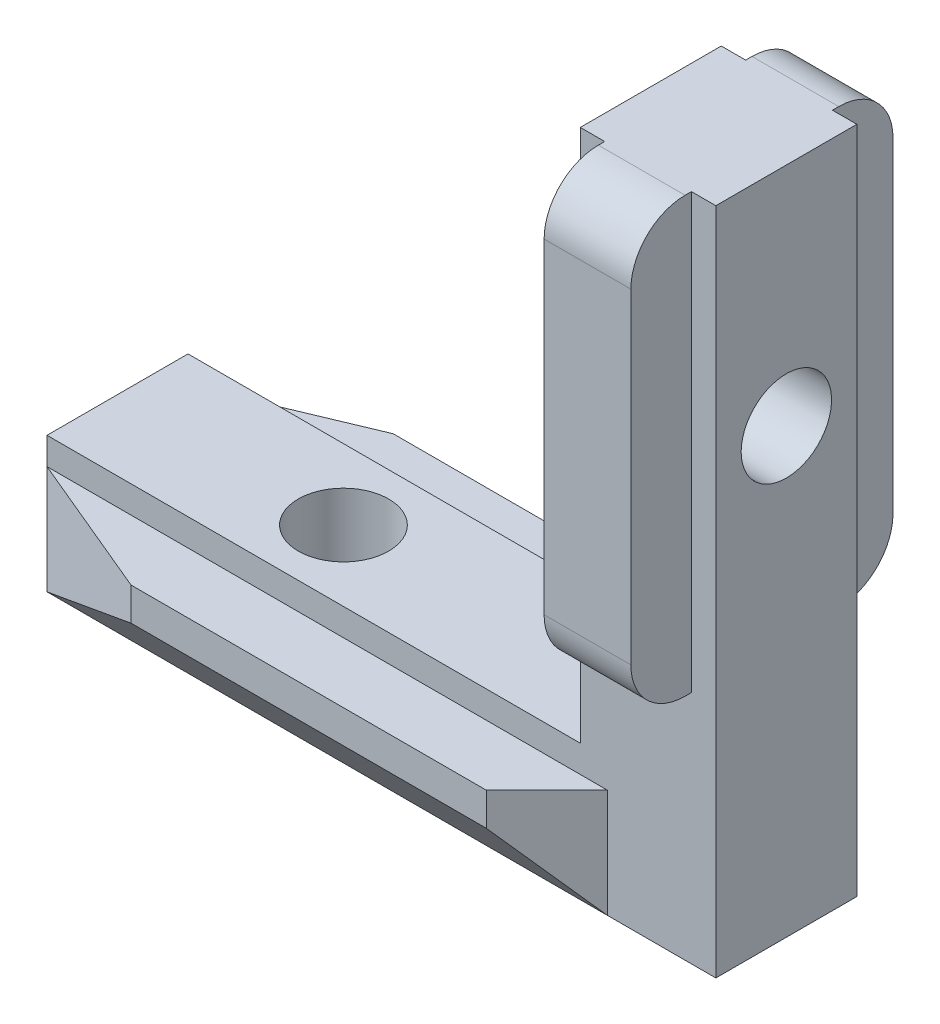
ISO-10303-21;
HEADER;
FILE_DESCRIPTION(('STEP AP214'),'2;1');
FILE_NAME('part.step','',(''),(''),'','','');
FILE_SCHEMA(('AUTOMOTIVE_DESIGN { 1 0 10303 214 1 1 1 1 }'));
ENDSEC;
DATA;
#1=APPLICATION_CONTEXT('core data for automotive mechanical design processes');
#2=APPLICATION_PROTOCOL_DEFINITION('international standard','automotive_design',2000,#1);
#3=PRODUCT_CONTEXT('',#1,'mechanical');
#4=PRODUCT('Part','Part','',(#3));
#5=PRODUCT_RELATED_PRODUCT_CATEGORY('part','',(#4));
#6=PRODUCT_DEFINITION_FORMATION('','',#4);
#7=PRODUCT_DEFINITION_CONTEXT('part definition',#1,'design');
#8=PRODUCT_DEFINITION('design','',#6,#7);
#9=PRODUCT_DEFINITION_SHAPE('','',#8);
#10=(LENGTH_UNIT() NAMED_UNIT(*) SI_UNIT(.MILLI.,.METRE.));
#11=(NAMED_UNIT(*) PLANE_ANGLE_UNIT() SI_UNIT($,.RADIAN.));
#12=(NAMED_UNIT(*) SI_UNIT($,.STERADIAN.) SOLID_ANGLE_UNIT());
#13=UNCERTAINTY_MEASURE_WITH_UNIT(LENGTH_MEASURE(1.E-05),#10,'distance_accuracy_value','');
#14=(GEOMETRIC_REPRESENTATION_CONTEXT(3) GLOBAL_UNCERTAINTY_ASSIGNED_CONTEXT((#13)) GLOBAL_UNIT_ASSIGNED_CONTEXT((#10,
#11,#12)) REPRESENTATION_CONTEXT('',''));
#15=CARTESIAN_POINT('',(0.,0.,0.));
#16=DIRECTION('',(0.,0.,1.));
#17=DIRECTION('',(1.,0.,0.));
#18=AXIS2_PLACEMENT_3D('',#15,#16,#17);
#19=CARTESIAN_POINT('',(0.,0.,-3.9));
#20=DIRECTION('',(0.,0.,1.));
#21=DIRECTION('',(1.,0.,0.));
#22=AXIS2_PLACEMENT_3D('',#19,#20,#21);
#23=PLANE('',#22);
#24=DIRECTION('',(0.,1.,0.));
#25=VECTOR('',#24,1.);
#26=CARTESIAN_POINT('',(-6.15,37.,-3.9));
#27=LINE('',#26,#25);
#28=CARTESIAN_POINT('',(-6.15,13.,-3.9));
#29=VERTEX_POINT('',#28);
#30=CARTESIAN_POINT('',(-6.15,37.,-3.9));
#31=VERTEX_POINT('',#30);
#32=EDGE_CURVE('E235',#29,#31,#27,.T.);
#33=ORIENTED_EDGE('',*,*,#32,.F.);
#34=DIRECTION('',(1.,0.,0.));
#35=VECTOR('',#34,1.);
#36=CARTESIAN_POINT('',(-6.15,13.,-3.9));
#37=LINE('',#36,#35);
#38=CARTESIAN_POINT('',(-1.35,13.,-3.9));
#39=VERTEX_POINT('',#38);
#40=EDGE_CURVE('E248',#29,#39,#37,.T.);
#41=ORIENTED_EDGE('',*,*,#40,.T.);
#42=DIRECTION('',(0.,1.,0.));
#43=VECTOR('',#42,1.);
#44=CARTESIAN_POINT('',(-1.35,37.,-3.9));
#45=LINE('',#44,#43);
#46=CARTESIAN_POINT('',(-1.35,37.,-3.9));
#47=VERTEX_POINT('',#46);
#48=EDGE_CURVE('E228',#39,#47,#45,.T.);
#49=ORIENTED_EDGE('',*,*,#48,.T.);
#50=DIRECTION('',(-1.,0.,0.));
#51=VECTOR('',#50,1.);
#52=CARTESIAN_POINT('',(-7.5,37.,-3.9));
#53=LINE('',#52,#51);
#54=CARTESIAN_POINT('',(0.,37.,-3.9));
#55=VERTEX_POINT('',#54);
#56=EDGE_CURVE('E422',#55,#47,#53,.T.);
#57=ORIENTED_EDGE('',*,*,#56,.F.);
#58=DIRECTION('',(0.,1.,0.));
#59=VECTOR('',#58,1.);
#60=CARTESIAN_POINT('',(0.,0.,-3.9));
#61=LINE('',#60,#59);
#62=CARTESIAN_POINT('',(0.,0.,-3.9));
#63=VERTEX_POINT('',#62);
#64=EDGE_CURVE('E414',#63,#55,#61,.T.);
#65=ORIENTED_EDGE('',*,*,#64,.F.);
#66=DIRECTION('',(1.,0.,0.));
#67=VECTOR('',#66,1.);
#68=CARTESIAN_POINT('',(-37.,0.,-3.9));
#69=LINE('',#68,#67);
#70=CARTESIAN_POINT('',(-6.0000000000001,0.,-3.9));
#71=VERTEX_POINT('',#70);
#72=EDGE_CURVE('E410',#71,#63,#69,.T.);
#73=ORIENTED_EDGE('',*,*,#72,.F.);
#74=DIRECTION('',(0.,1.,0.));
#75=VECTOR('',#74,1.);
#76=CARTESIAN_POINT('',(-6.0000000000001,0.,-3.9));
#77=LINE('',#76,#75);
#78=CARTESIAN_POINT('',(-6.0000000000001,6.,-3.9));
#79=VERTEX_POINT('',#78);
#80=EDGE_CURVE('E11',#71,#79,#77,.T.);
#81=ORIENTED_EDGE('',*,*,#80,.T.);
#82=DIRECTION('',(-1.,0.,0.));
#83=VECTOR('',#82,1.);
#84=CARTESIAN_POINT('',(-1.35,6.,-3.9));
#85=LINE('',#84,#83);
#86=CARTESIAN_POINT('',(-37.,6.,-3.9));
#87=VERTEX_POINT('',#86);
#88=EDGE_CURVE('E275',#79,#87,#85,.T.);
#89=ORIENTED_EDGE('',*,*,#88,.T.);
#90=DIRECTION('',(0.,-1.,0.));
#91=VECTOR('',#90,1.);
#92=CARTESIAN_POINT('',(-37.,7.5,-3.9));
#93=LINE('',#92,#91);
#94=CARTESIAN_POINT('',(-37.,7.5,-3.9));
#95=VERTEX_POINT('',#94);
#96=EDGE_CURVE('E280',#95,#87,#93,.T.);
#97=ORIENTED_EDGE('',*,*,#96,.F.);
#98=DIRECTION('',(-1.,0.,0.));
#99=VECTOR('',#98,1.);
#100=CARTESIAN_POINT('',(-37.,7.5,-3.9));
#101=LINE('',#100,#99);
#102=CARTESIAN_POINT('',(-7.5,7.5,-3.9));
#103=VERTEX_POINT('',#102);
#104=EDGE_CURVE('E385',#103,#95,#101,.T.);
#105=ORIENTED_EDGE('',*,*,#104,.F.);
#106=DIRECTION('',(0.,-1.,0.));
#107=VECTOR('',#106,1.);
#108=CARTESIAN_POINT('',(-7.5,7.5,-3.9));
#109=LINE('',#108,#107);
#110=CARTESIAN_POINT('',(-7.5,37.,-3.9));
#111=VERTEX_POINT('',#110);
#112=EDGE_CURVE('E387',#111,#103,#109,.T.);
#113=ORIENTED_EDGE('',*,*,#112,.F.);
#114=EDGE_CURVE('E417',#31,#111,#53,.T.);
#115=ORIENTED_EDGE('',*,*,#114,.F.);
#116=EDGE_LOOP('',(#33,#41,#49,#57,#65,#73,#81,#89,#97,#105,#113,#115));
#117=FACE_BOUND('',#116,.T.);
#118=ADVANCED_FACE('F37',(#117),#23,.F.);
#119=CARTESIAN_POINT('',(-37.,7.5,3.9));
#120=DIRECTION('',(1.,0.,0.));
#121=DIRECTION('',(0.,0.,-1.));
#122=AXIS2_PLACEMENT_3D('',#119,#120,#121);
#123=PLANE('',#122);
#124=DIRECTION('',(0.,0.,-1.));
#125=VECTOR('',#124,1.);
#126=CARTESIAN_POINT('',(-37.,0.,3.9));
#127=LINE('',#126,#125);
#128=CARTESIAN_POINT('',(-37.,0.,3.9));
#129=VERTEX_POINT('',#128);
#130=CARTESIAN_POINT('',(-37.,0.,-3.9));
#131=VERTEX_POINT('',#130);
#132=EDGE_CURVE('E338',#129,#131,#127,.T.);
#133=ORIENTED_EDGE('',*,*,#132,.F.);
#134=DIRECTION('',(0.,1.,0.));
#135=VECTOR('',#134,1.);
#136=CARTESIAN_POINT('',(-37.,6.,3.9));
#137=LINE('',#136,#135);
#138=CARTESIAN_POINT('',(-37.,6.,3.9));
#139=VERTEX_POINT('',#138);
#140=EDGE_CURVE('E337',#129,#139,#137,.T.);
#141=ORIENTED_EDGE('',*,*,#140,.T.);
#142=DIRECTION('',(0.,-1.,0.));
#143=VECTOR('',#142,1.);
#144=CARTESIAN_POINT('',(-37.,7.5,3.9));
#145=LINE('',#144,#143);
#146=CARTESIAN_POINT('',(-37.,7.5,3.9));
#147=VERTEX_POINT('',#146);
#148=EDGE_CURVE('E381',#147,#139,#145,.T.);
#149=ORIENTED_EDGE('',*,*,#148,.F.);
#150=DIRECTION('',(0.,0.,-1.));
#151=VECTOR('',#150,1.);
#152=CARTESIAN_POINT('',(-37.,7.5,3.9));
#153=LINE('',#152,#151);
#154=EDGE_CURVE('E404',#147,#95,#153,.T.);
#155=ORIENTED_EDGE('',*,*,#154,.T.);
#156=ORIENTED_EDGE('',*,*,#96,.T.);
#157=DIRECTION('',(0.,-1.,0.));
#158=VECTOR('',#157,1.);
#159=CARTESIAN_POINT('',(-37.,4.17437438349128,-3.9));
#160=LINE('',#159,#158);
#161=EDGE_CURVE('E334',#87,#131,#160,.T.);
#162=ORIENTED_EDGE('',*,*,#161,.T.);
#163=EDGE_LOOP('',(#133,#141,#149,#155,#156,#162));
#164=FACE_BOUND('',#163,.T.);
#165=ADVANCED_FACE('F379',(#164),#123,.F.);
#166=CARTESIAN_POINT('',(-37.,0.,3.9));
#167=DIRECTION('',(0.,1.,0.));
#168=DIRECTION('',(0.,0.,1.));
#169=AXIS2_PLACEMENT_3D('',#166,#167,#168);
#170=PLANE('',#169);
#171=CARTESIAN_POINT('',(-24.5,0.,0.));
#172=DIRECTION('',(0.,1.,0.));
#173=DIRECTION('',(0.,0.,1.));
#174=AXIS2_PLACEMENT_3D('',#171,#172,#173);
#175=CIRCLE('',#174,2.5);
#176=CARTESIAN_POINT('',(-24.5,0.,2.5));
#177=VERTEX_POINT('',#176);
#178=EDGE_CURVE('E754',#177,#177,#175,.T.);
#179=ORIENTED_EDGE('',*,*,#178,.T.);
#180=EDGE_LOOP('',(#179));
#181=FACE_BOUND('',#180,.T.);
#182=EDGE_CURVE('E390',#131,#71,#69,.T.);
#183=ORIENTED_EDGE('',*,*,#182,.T.);
#184=ORIENTED_EDGE('',*,*,#72,.T.);
#185=DIRECTION('',(0.,0.,-1.));
#186=VECTOR('',#185,1.);
#187=CARTESIAN_POINT('',(0.,0.,3.9));
#188=LINE('',#187,#186);
#189=CARTESIAN_POINT('',(0.,0.,3.9));
#190=VERTEX_POINT('',#189);
#191=EDGE_CURVE('E435',#190,#63,#188,.T.);
#192=ORIENTED_EDGE('',*,*,#191,.F.);
#193=DIRECTION('',(1.,0.,0.));
#194=VECTOR('',#193,1.);
#195=CARTESIAN_POINT('',(-37.,0.,3.9));
#196=LINE('',#195,#194);
#197=CARTESIAN_POINT('',(-6.00000000000011,0.,3.9));
#198=VERTEX_POINT('',#197);
#199=EDGE_CURVE('E300',#198,#190,#196,.T.);
#200=ORIENTED_EDGE('',*,*,#199,.F.);
#201=EDGE_CURVE('E307',#129,#198,#196,.T.);
#202=ORIENTED_EDGE('',*,*,#201,.F.);
#203=ORIENTED_EDGE('',*,*,#132,.T.);
#204=EDGE_LOOP('',(#183,#184,#192,#200,#202,#203));
#205=FACE_BOUND('',#204,.T.);
#206=ADVANCED_FACE('F437',(#181,#205),#170,.F.);
#207=CARTESIAN_POINT('',(0.,0.,3.9));
#208=DIRECTION('',(-1.,0.,0.));
#209=DIRECTION('',(0.,0.,1.));
#210=AXIS2_PLACEMENT_3D('',#207,#208,#209);
#211=PLANE('',#210);
#212=CARTESIAN_POINT('',(0.,24.5,0.));
#213=DIRECTION('',(-1.,0.,0.));
#214=DIRECTION('',(0.,0.,1.));
#215=AXIS2_PLACEMENT_3D('',#212,#213,#214);
#216=CIRCLE('',#215,2.5);
#217=CARTESIAN_POINT('',(0.,24.5,2.5));
#218=VERTEX_POINT('',#217);
#219=EDGE_CURVE('E750',#218,#218,#216,.T.);
#220=ORIENTED_EDGE('',*,*,#219,.T.);
#221=EDGE_LOOP('',(#220));
#222=FACE_BOUND('',#221,.T.);
#223=ORIENTED_EDGE('',*,*,#64,.T.);
#224=DIRECTION('',(0.,0.,-1.));
#225=VECTOR('',#224,1.);
#226=CARTESIAN_POINT('',(0.,37.,3.9));
#227=LINE('',#226,#225);
#228=CARTESIAN_POINT('',(0.,37.,3.9));
#229=VERTEX_POINT('',#228);
#230=EDGE_CURVE('E434',#229,#55,#227,.T.);
#231=ORIENTED_EDGE('',*,*,#230,.F.);
#232=DIRECTION('',(0.,1.,0.));
#233=VECTOR('',#232,1.);
#234=CARTESIAN_POINT('',(0.,0.,3.9));
#235=LINE('',#234,#233);
#236=EDGE_CURVE('E316',#190,#229,#235,.T.);
#237=ORIENTED_EDGE('',*,*,#236,.F.);
#238=ORIENTED_EDGE('',*,*,#191,.T.);
#239=EDGE_LOOP('',(#223,#231,#237,#238));
#240=FACE_BOUND('',#239,.T.);
#241=ADVANCED_FACE('F439',(#222,#240),#211,.F.);
#242=CARTESIAN_POINT('',(-7.5,37.,3.9));
#243=DIRECTION('',(0.,-1.,0.));
#244=DIRECTION('',(0.,0.,-1.));
#245=AXIS2_PLACEMENT_3D('',#242,#243,#244);
#246=PLANE('',#245);
#247=ORIENTED_EDGE('',*,*,#56,.T.);
#248=DIRECTION('',(0.,0.,-1.));
#249=VECTOR('',#248,1.);
#250=CARTESIAN_POINT('',(-1.35,37.,-3.9));
#251=LINE('',#250,#249);
#252=CARTESIAN_POINT('',(-1.35,37.,-4.24999999999998));
#253=VERTEX_POINT('',#252);
#254=EDGE_CURVE('E60',#47,#253,#251,.T.);
#255=ORIENTED_EDGE('',*,*,#254,.T.);
#256=DIRECTION('',(1.,0.,0.));
#257=VECTOR('',#256,1.);
#258=CARTESIAN_POINT('',(-6.15,37.,-4.24999999999998));
#259=LINE('',#258,#257);
#260=CARTESIAN_POINT('',(-6.15,37.,-4.24999999999998));
#261=VERTEX_POINT('',#260);
#262=EDGE_CURVE('E269',#261,#253,#259,.T.);
#263=ORIENTED_EDGE('',*,*,#262,.F.);
#264=DIRECTION('',(0.,0.,-1.));
#265=VECTOR('',#264,1.);
#266=CARTESIAN_POINT('',(-6.15,37.,-3.9));
#267=LINE('',#266,#265);
#268=EDGE_CURVE('E238',#31,#261,#267,.T.);
#269=ORIENTED_EDGE('',*,*,#268,.F.);
#270=ORIENTED_EDGE('',*,*,#114,.T.);
#271=DIRECTION('',(0.,0.,-1.));
#272=VECTOR('',#271,1.);
#273=CARTESIAN_POINT('',(-7.5,37.,3.9));
#274=LINE('',#273,#272);
#275=CARTESIAN_POINT('',(-7.5,37.,3.9));
#276=VERTEX_POINT('',#275);
#277=EDGE_CURVE('E431',#276,#111,#274,.T.);
#278=ORIENTED_EDGE('',*,*,#277,.F.);
#279=DIRECTION('',(-1.,0.,0.));
#280=VECTOR('',#279,1.);
#281=CARTESIAN_POINT('',(-7.5,37.,3.9));
#282=LINE('',#281,#280);
#283=CARTESIAN_POINT('',(-6.15,37.,3.9));
#284=VERTEX_POINT('',#283);
#285=EDGE_CURVE('E397',#284,#276,#282,.T.);
#286=ORIENTED_EDGE('',*,*,#285,.F.);
#287=DIRECTION('',(0.,0.,-1.));
#288=VECTOR('',#287,1.);
#289=CARTESIAN_POINT('',(-6.15,37.,3.9));
#290=LINE('',#289,#288);
#291=CARTESIAN_POINT('',(-6.15,37.,4.24999999999998));
#292=VERTEX_POINT('',#291);
#293=EDGE_CURVE('E760',#292,#284,#290,.T.);
#294=ORIENTED_EDGE('',*,*,#293,.F.);
#295=DIRECTION('',(1.,0.,0.));
#296=VECTOR('',#295,1.);
#297=CARTESIAN_POINT('',(-6.15,37.,4.24999999999998));
#298=LINE('',#297,#296);
#299=CARTESIAN_POINT('',(-1.35,37.,4.24999999999998));
#300=VERTEX_POINT('',#299);
#301=EDGE_CURVE('E231',#292,#300,#298,.T.);
#302=ORIENTED_EDGE('',*,*,#301,.T.);
#303=DIRECTION('',(0.,0.,-1.));
#304=VECTOR('',#303,1.);
#305=CARTESIAN_POINT('',(-1.35,37.,3.9));
#306=LINE('',#305,#304);
#307=CARTESIAN_POINT('',(-1.35,37.,3.9));
#308=VERTEX_POINT('',#307);
#309=EDGE_CURVE('E771',#300,#308,#306,.T.);
#310=ORIENTED_EDGE('',*,*,#309,.T.);
#311=EDGE_CURVE('E398',#229,#308,#282,.T.);
#312=ORIENTED_EDGE('',*,*,#311,.F.);
#313=ORIENTED_EDGE('',*,*,#230,.T.);
#314=EDGE_LOOP('',(#247,#255,#263,#269,#270,#278,#286,#294,#302,#310,#312,#313));
#315=FACE_BOUND('',#314,.T.);
#316=ADVANCED_FACE('F446',(#315),#246,.F.);
#317=CARTESIAN_POINT('',(-7.5,7.5,3.9));
#318=DIRECTION('',(1.,0.,0.));
#319=DIRECTION('',(0.,0.,-1.));
#320=AXIS2_PLACEMENT_3D('',#317,#318,#319);
#321=PLANE('',#320);
#322=CARTESIAN_POINT('',(-7.49999999999999,24.5,0.));
#323=DIRECTION('',(-1.,0.,0.));
#324=DIRECTION('',(0.,0.,1.));
#325=AXIS2_PLACEMENT_3D('',#322,#323,#324);
#326=CIRCLE('',#325,2.5);
#327=CARTESIAN_POINT('',(-7.49999999999999,24.5,2.5));
#328=VERTEX_POINT('',#327);
#329=EDGE_CURVE('E747',#328,#328,#326,.T.);
#330=ORIENTED_EDGE('',*,*,#329,.F.);
#331=EDGE_LOOP('',(#330));
#332=FACE_BOUND('',#331,.T.);
#333=ORIENTED_EDGE('',*,*,#112,.T.);
#334=DIRECTION('',(0.,0.,-1.));
#335=VECTOR('',#334,1.);
#336=CARTESIAN_POINT('',(-7.5,7.5,3.9));
#337=LINE('',#336,#335);
#338=CARTESIAN_POINT('',(-7.5,7.5,3.9));
#339=VERTEX_POINT('',#338);
#340=EDGE_CURVE('E428',#339,#103,#337,.T.);
#341=ORIENTED_EDGE('',*,*,#340,.F.);
#342=DIRECTION('',(0.,-1.,0.));
#343=VECTOR('',#342,1.);
#344=CARTESIAN_POINT('',(-7.5,7.5,3.9));
#345=LINE('',#344,#343);
#346=EDGE_CURVE('E401',#276,#339,#345,.T.);
#347=ORIENTED_EDGE('',*,*,#346,.F.);
#348=ORIENTED_EDGE('',*,*,#277,.T.);
#349=EDGE_LOOP('',(#333,#341,#347,#348));
#350=FACE_BOUND('',#349,.T.);
#351=ADVANCED_FACE('F463',(#332,#350),#321,.F.);
#352=CARTESIAN_POINT('',(-37.,7.5,3.9));
#353=DIRECTION('',(0.,-1.,0.));
#354=DIRECTION('',(0.,0.,-1.));
#355=AXIS2_PLACEMENT_3D('',#352,#353,#354);
#356=PLANE('',#355);
#357=CARTESIAN_POINT('',(-24.5,7.5,0.));
#358=DIRECTION('',(0.,1.,0.));
#359=DIRECTION('',(0.,0.,1.));
#360=AXIS2_PLACEMENT_3D('',#357,#358,#359);
#361=CIRCLE('',#360,2.5);
#362=CARTESIAN_POINT('',(-24.5,7.5,2.5));
#363=VERTEX_POINT('',#362);
#364=EDGE_CURVE('E751',#363,#363,#361,.T.);
#365=ORIENTED_EDGE('',*,*,#364,.F.);
#366=EDGE_LOOP('',(#365));
#367=FACE_BOUND('',#366,.T.);
#368=ORIENTED_EDGE('',*,*,#104,.T.);
#369=ORIENTED_EDGE('',*,*,#154,.F.);
#370=DIRECTION('',(-1.,0.,0.));
#371=VECTOR('',#370,1.);
#372=CARTESIAN_POINT('',(-37.,7.5,3.9));
#373=LINE('',#372,#371);
#374=EDGE_CURVE('E383',#339,#147,#373,.T.);
#375=ORIENTED_EDGE('',*,*,#374,.F.);
#376=ORIENTED_EDGE('',*,*,#340,.T.);
#377=EDGE_LOOP('',(#368,#369,#375,#376));
#378=FACE_BOUND('',#377,.T.);
#379=ADVANCED_FACE('F460',(#367,#378),#356,.F.);
#380=CARTESIAN_POINT('',(0.,0.,3.9));
#381=DIRECTION('',(0.,0.,1.));
#382=DIRECTION('',(1.,0.,0.));
#383=AXIS2_PLACEMENT_3D('',#380,#381,#382);
#384=PLANE('',#383);
#385=DIRECTION('',(0.,-1.,0.));
#386=VECTOR('',#385,1.);
#387=CARTESIAN_POINT('',(-6.15,37.,3.9));
#388=LINE('',#387,#386);
#389=CARTESIAN_POINT('',(-6.15,13.,3.9));
#390=VERTEX_POINT('',#389);
#391=EDGE_CURVE('E762',#284,#390,#388,.T.);
#392=ORIENTED_EDGE('',*,*,#391,.F.);
#393=ORIENTED_EDGE('',*,*,#285,.T.);
#394=ORIENTED_EDGE('',*,*,#346,.T.);
#395=ORIENTED_EDGE('',*,*,#374,.T.);
#396=ORIENTED_EDGE('',*,*,#148,.T.);
#397=DIRECTION('',(-1.,0.,0.));
#398=VECTOR('',#397,1.);
#399=CARTESIAN_POINT('',(-1.35,6.,3.9));
#400=LINE('',#399,#398);
#401=CARTESIAN_POINT('',(-6.0000000000001,6.,3.9));
#402=VERTEX_POINT('',#401);
#403=EDGE_CURVE('E272',#402,#139,#400,.T.);
#404=ORIENTED_EDGE('',*,*,#403,.F.);
#405=DIRECTION('',(0.,-1.,0.));
#406=VECTOR('',#405,1.);
#407=CARTESIAN_POINT('',(-6.0000000000001,4.17437438349128,3.9));
#408=LINE('',#407,#406);
#409=EDGE_CURVE('E45',#402,#198,#408,.T.);
#410=ORIENTED_EDGE('',*,*,#409,.T.);
#411=ORIENTED_EDGE('',*,*,#199,.T.);
#412=ORIENTED_EDGE('',*,*,#236,.T.);
#413=ORIENTED_EDGE('',*,*,#311,.T.);
#414=DIRECTION('',(0.,-1.,0.));
#415=VECTOR('',#414,1.);
#416=CARTESIAN_POINT('',(-1.35,37.,3.9));
#417=LINE('',#416,#415);
#418=CARTESIAN_POINT('',(-1.35,13.,3.9));
#419=VERTEX_POINT('',#418);
#420=EDGE_CURVE('E773',#308,#419,#417,.T.);
#421=ORIENTED_EDGE('',*,*,#420,.T.);
#422=DIRECTION('',(1.,0.,0.));
#423=VECTOR('',#422,1.);
#424=CARTESIAN_POINT('',(-6.15,13.,3.9));
#425=LINE('',#424,#423);
#426=EDGE_CURVE('E778',#390,#419,#425,.T.);
#427=ORIENTED_EDGE('',*,*,#426,.F.);
#428=EDGE_LOOP('',(#392,#393,#394,#395,#396,#404,#410,#411,#412,#413,#421,#427));
#429=FACE_BOUND('',#428,.T.);
#430=ADVANCED_FACE('F299',(#429),#384,.T.);
#431=CARTESIAN_POINT('',(-1.35,0.,-3.9));
#432=DIRECTION('',(0.,-0.625890557617799,-0.779910898683228));
#433=DIRECTION('',(0.,0.779910898683228,-0.625890557617799));
#434=AXIS2_PLACEMENT_3D('',#431,#432,#433);
#435=PLANE('',#434);
#436=DIRECTION('',(-1.,0.,0.));
#437=VECTOR('',#436,1.);
#438=CARTESIAN_POINT('',(-1.35,4.17437438349128,-7.25));
#439=LINE('',#438,#437);
#440=CARTESIAN_POINT('',(-9.35000000000014,4.17437438349129,-7.25));
#441=VERTEX_POINT('',#440);
#442=CARTESIAN_POINT('',(-28.9999999999999,4.17437438349128,-7.25));
#443=VERTEX_POINT('',#442);
#444=EDGE_CURVE('E278',#441,#443,#439,.T.);
#445=ORIENTED_EDGE('',*,*,#444,.F.);
#446=DIRECTION('',(0.53054167297435,-0.661098378817527,0.530541672974345));
#447=VECTOR('',#446,1.);
#448=CARTESIAN_POINT('',(-4.69114372955481,-1.63094211552797,-2.59114372955472));
#449=LINE('',#448,#447);
#450=EDGE_CURVE('E290',#441,#71,#449,.T.);
#451=ORIENTED_EDGE('',*,*,#450,.T.);
#452=ORIENTED_EDGE('',*,*,#182,.F.);
#453=DIRECTION('',(0.831136190853748,0.433684203036549,-0.348038279920005));
#454=VECTOR('',#453,1.);
#455=CARTESIAN_POINT('',(-12.3734303398238,12.8500651928378,-14.2123760451987));
#456=LINE('',#455,#454);
#457=EDGE_CURVE('E354',#131,#443,#456,.T.);
#458=ORIENTED_EDGE('',*,*,#457,.T.);
#459=EDGE_LOOP('',(#445,#451,#452,#458));
#460=FACE_BOUND('',#459,.T.);
#461=ADVANCED_FACE('F517',(#460),#435,.T.);
#462=CARTESIAN_POINT('',(-1.35,4.17437438349128,-7.25));
#463=DIRECTION('',(0.,0.,-1.));
#464=DIRECTION('',(-1.,0.,0.));
#465=AXIS2_PLACEMENT_3D('',#462,#463,#464);
#466=PLANE('',#465);
#467=DIRECTION('',(-1.,0.,0.));
#468=VECTOR('',#467,1.);
#469=CARTESIAN_POINT('',(-1.35,6.,-7.25));
#470=LINE('',#469,#468);
#471=CARTESIAN_POINT('',(-9.35000000000014,6.,-7.25));
#472=VERTEX_POINT('',#471);
#473=CARTESIAN_POINT('',(-28.9999999999999,6.,-7.25));
#474=VERTEX_POINT('',#473);
#475=EDGE_CURVE('E281',#472,#474,#470,.T.);
#476=ORIENTED_EDGE('',*,*,#475,.F.);
#477=DIRECTION('',(0.,-1.,0.));
#478=VECTOR('',#477,1.);
#479=CARTESIAN_POINT('',(-9.35000000000014,4.17437438349128,-7.25));
#480=LINE('',#479,#478);
#481=EDGE_CURVE('E322',#472,#441,#480,.T.);
#482=ORIENTED_EDGE('',*,*,#481,.T.);
#483=ORIENTED_EDGE('',*,*,#444,.T.);
#484=DIRECTION('',(0.,1.,0.));
#485=VECTOR('',#484,1.);
#486=CARTESIAN_POINT('',(-28.9999999999999,6.,-7.25));
#487=LINE('',#486,#485);
#488=EDGE_CURVE('E357',#443,#474,#487,.T.);
#489=ORIENTED_EDGE('',*,*,#488,.T.);
#490=EDGE_LOOP('',(#476,#482,#483,#489));
#491=FACE_BOUND('',#490,.T.);
#492=ADVANCED_FACE('F515',(#491),#466,.T.);
#493=CARTESIAN_POINT('',(-1.35,6.,-7.25));
#494=DIRECTION('',(0.,1.,0.));
#495=DIRECTION('',(0.,0.,1.));
#496=AXIS2_PLACEMENT_3D('',#493,#494,#495);
#497=PLANE('',#496);
#498=ORIENTED_EDGE('',*,*,#88,.F.);
#499=DIRECTION('',(-0.707106781186551,0.,-0.707106781186544));
#500=VECTOR('',#499,1.);
#501=CARTESIAN_POINT('',(-5.35000000000003,6.,-3.24999999999993));
#502=LINE('',#501,#500);
#503=EDGE_CURVE('E292',#79,#472,#502,.T.);
#504=ORIENTED_EDGE('',*,*,#503,.T.);
#505=ORIENTED_EDGE('',*,*,#475,.T.);
#506=DIRECTION('',(-0.922393227341063,0.,0.386252163949068));
#507=VECTOR('',#506,1.);
#508=CARTESIAN_POINT('',(-5.47512379939507,6.,-17.1010419090032));
#509=LINE('',#508,#507);
#510=EDGE_CURVE('E360',#474,#87,#509,.T.);
#511=ORIENTED_EDGE('',*,*,#510,.T.);
#512=EDGE_LOOP('',(#498,#504,#505,#511));
#513=FACE_BOUND('',#512,.T.);
#514=ADVANCED_FACE('F508',(#513),#497,.T.);
#515=CARTESIAN_POINT('',(-1.35,6.,7.25));
#516=DIRECTION('',(0.,1.,0.));
#517=DIRECTION('',(0.,0.,1.));
#518=AXIS2_PLACEMENT_3D('',#515,#516,#517);
#519=PLANE('',#518);
#520=DIRECTION('',(-1.,0.,0.));
#521=VECTOR('',#520,1.);
#522=CARTESIAN_POINT('',(-1.35,6.,7.25));
#523=LINE('',#522,#521);
#524=CARTESIAN_POINT('',(-9.35000000000014,6.,7.25));
#525=VERTEX_POINT('',#524);
#526=CARTESIAN_POINT('',(-28.9999999999999,6.,7.25));
#527=VERTEX_POINT('',#526);
#528=EDGE_CURVE('E273',#525,#527,#523,.T.);
#529=ORIENTED_EDGE('',*,*,#528,.F.);
#530=DIRECTION('',(0.707106781186551,0.,-0.707106781186544));
#531=VECTOR('',#530,1.);
#532=CARTESIAN_POINT('',(-5.35000000000003,6.,3.24999999999993));
#533=LINE('',#532,#531);
#534=EDGE_CURVE('E323',#525,#402,#533,.T.);
#535=ORIENTED_EDGE('',*,*,#534,.T.);
#536=ORIENTED_EDGE('',*,*,#403,.T.);
#537=DIRECTION('',(0.922393227341063,0.,0.386252163949068));
#538=VECTOR('',#537,1.);
#539=CARTESIAN_POINT('',(-5.47512379939507,6.,17.1010419090032));
#540=LINE('',#539,#538);
#541=EDGE_CURVE('E343',#139,#527,#540,.T.);
#542=ORIENTED_EDGE('',*,*,#541,.T.);
#543=EDGE_LOOP('',(#529,#535,#536,#542));
#544=FACE_BOUND('',#543,.T.);
#545=ADVANCED_FACE('F371',(#544),#519,.T.);
#546=CARTESIAN_POINT('',(-1.35,4.17437438349128,7.25));
#547=DIRECTION('',(0.,0.,1.));
#548=DIRECTION('',(1.,0.,0.));
#549=AXIS2_PLACEMENT_3D('',#546,#547,#548);
#550=PLANE('',#549);
#551=DIRECTION('',(-1.,0.,0.));
#552=VECTOR('',#551,1.);
#553=CARTESIAN_POINT('',(-1.35,4.17437438349128,7.25));
#554=LINE('',#553,#552);
#555=CARTESIAN_POINT('',(-9.35000000000014,4.17437438349129,7.25));
#556=VERTEX_POINT('',#555);
#557=CARTESIAN_POINT('',(-29.,4.17437438349129,7.25));
#558=VERTEX_POINT('',#557);
#559=EDGE_CURVE('E276',#556,#558,#554,.T.);
#560=ORIENTED_EDGE('',*,*,#559,.F.);
#561=DIRECTION('',(0.,1.,0.));
#562=VECTOR('',#561,1.);
#563=CARTESIAN_POINT('',(-9.35000000000014,6.,7.25));
#564=LINE('',#563,#562);
#565=EDGE_CURVE('E321',#556,#525,#564,.T.);
#566=ORIENTED_EDGE('',*,*,#565,.T.);
#567=ORIENTED_EDGE('',*,*,#528,.T.);
#568=DIRECTION('',(0.,-1.,0.));
#569=VECTOR('',#568,1.);
#570=CARTESIAN_POINT('',(-28.9999999999999,4.17437438349128,7.25));
#571=LINE('',#570,#569);
#572=EDGE_CURVE('E348',#527,#558,#571,.T.);
#573=ORIENTED_EDGE('',*,*,#572,.T.);
#574=EDGE_LOOP('',(#560,#566,#567,#573));
#575=FACE_BOUND('',#574,.T.);
#576=ADVANCED_FACE('F369',(#575),#550,.T.);
#577=CARTESIAN_POINT('',(-1.35,0.,3.9));
#578=DIRECTION('',(0.,-0.625890557617799,0.779910898683228));
#579=DIRECTION('',(0.,-0.779910898683228,-0.625890557617799));
#580=AXIS2_PLACEMENT_3D('',#577,#578,#579);
#581=PLANE('',#580);
#582=ORIENTED_EDGE('',*,*,#201,.T.);
#583=DIRECTION('',(-0.53054167297435,0.661098378817527,0.530541672974345));
#584=VECTOR('',#583,1.);
#585=CARTESIAN_POINT('',(-4.69114372955481,-1.63094211552797,2.59114372955472));
#586=LINE('',#585,#584);
#587=EDGE_CURVE('E309',#198,#556,#586,.T.);
#588=ORIENTED_EDGE('',*,*,#587,.T.);
#589=ORIENTED_EDGE('',*,*,#559,.T.);
#590=DIRECTION('',(-0.831136190853748,-0.433684203036549,-0.348038279920005));
#591=VECTOR('',#590,1.);
#592=CARTESIAN_POINT('',(-12.3734303398238,12.8500651928378,14.2123760451987));
#593=LINE('',#592,#591);
#594=EDGE_CURVE('E312',#558,#129,#593,.T.);
#595=ORIENTED_EDGE('',*,*,#594,.T.);
#596=EDGE_LOOP('',(#582,#588,#589,#595));
#597=FACE_BOUND('',#596,.T.);
#598=ADVANCED_FACE('F308',(#597),#581,.T.);
#599=CARTESIAN_POINT('',(-37.,7.5,3.9));
#600=DIRECTION('',(-0.386252163949068,0.,0.922393227341063));
#601=DIRECTION('',(0.,-1.,0.));
#602=AXIS2_PLACEMENT_3D('',#599,#600,#601);
#603=PLANE('',#602);
#604=ORIENTED_EDGE('',*,*,#594,.F.);
#605=ORIENTED_EDGE('',*,*,#572,.F.);
#606=ORIENTED_EDGE('',*,*,#541,.F.);
#607=ORIENTED_EDGE('',*,*,#140,.F.);
#608=EDGE_LOOP('',(#604,#605,#606,#607));
#609=FACE_BOUND('',#608,.T.);
#610=ADVANCED_FACE('F376',(#609),#603,.T.);
#611=CARTESIAN_POINT('',(-37.,7.5,-3.9));
#612=DIRECTION('',(-0.386252163949068,0.,-0.922393227341063));
#613=DIRECTION('',(0.,1.,0.));
#614=AXIS2_PLACEMENT_3D('',#611,#612,#613);
#615=PLANE('',#614);
#616=ORIENTED_EDGE('',*,*,#510,.F.);
#617=ORIENTED_EDGE('',*,*,#488,.F.);
#618=ORIENTED_EDGE('',*,*,#457,.F.);
#619=ORIENTED_EDGE('',*,*,#161,.F.);
#620=EDGE_LOOP('',(#616,#617,#618,#619));
#621=FACE_BOUND('',#620,.T.);
#622=ADVANCED_FACE('F520',(#621),#615,.T.);
#623=CARTESIAN_POINT('',(-9.35000000000014,4.17437438349128,7.25));
#624=DIRECTION('',(0.707106781186544,0.,0.707106781186551));
#625=DIRECTION('',(0.,-1.,0.));
#626=AXIS2_PLACEMENT_3D('',#623,#624,#625);
#627=PLANE('',#626);
#628=ORIENTED_EDGE('',*,*,#587,.F.);
#629=ORIENTED_EDGE('',*,*,#409,.F.);
#630=ORIENTED_EDGE('',*,*,#534,.F.);
#631=ORIENTED_EDGE('',*,*,#565,.F.);
#632=EDGE_LOOP('',(#628,#629,#630,#631));
#633=FACE_BOUND('',#632,.T.);
#634=ADVANCED_FACE('F319',(#633),#627,.T.);
#635=CARTESIAN_POINT('',(-9.35000000000014,4.17437438349128,-7.25));
#636=DIRECTION('',(0.707106781186544,0.,-0.707106781186551));
#637=DIRECTION('',(0.,1.,0.));
#638=AXIS2_PLACEMENT_3D('',#635,#636,#637);
#639=PLANE('',#638);
#640=ORIENTED_EDGE('',*,*,#503,.F.);
#641=ORIENTED_EDGE('',*,*,#80,.F.);
#642=ORIENTED_EDGE('',*,*,#450,.F.);
#643=ORIENTED_EDGE('',*,*,#481,.F.);
#644=EDGE_LOOP('',(#640,#641,#642,#643));
#645=FACE_BOUND('',#644,.T.);
#646=ADVANCED_FACE('F39',(#645),#639,.T.);
#647=CARTESIAN_POINT('',(-6.15,34.,-4.25));
#648=DIRECTION('',(1.,0.,0.));
#649=DIRECTION('',(0.,0.,-1.));
#650=AXIS2_PLACEMENT_3D('',#647,#648,#649);
#651=CYLINDRICAL_SURFACE('',#650,3.);
#652=CARTESIAN_POINT('',(-1.35,34.,-4.25));
#653=DIRECTION('',(-1.,0.,0.));
#654=DIRECTION('',(0.,0.,1.));
#655=AXIS2_PLACEMENT_3D('',#652,#653,#654);
#656=CIRCLE('',#655,3.);
#657=CARTESIAN_POINT('',(-1.35,34.,-7.25));
#658=VERTEX_POINT('',#657);
#659=EDGE_CURVE('E251',#253,#658,#656,.T.);
#660=ORIENTED_EDGE('',*,*,#659,.T.);
#661=DIRECTION('',(1.,0.,0.));
#662=VECTOR('',#661,1.);
#663=CARTESIAN_POINT('',(-6.15,34.,-7.25));
#664=LINE('',#663,#662);
#665=CARTESIAN_POINT('',(-6.15,34.,-7.25));
#666=VERTEX_POINT('',#665);
#667=EDGE_CURVE('E266',#666,#658,#664,.T.);
#668=ORIENTED_EDGE('',*,*,#667,.F.);
#669=CARTESIAN_POINT('',(-6.15,34.,-4.25));
#670=DIRECTION('',(-1.,0.,0.));
#671=DIRECTION('',(0.,0.,1.));
#672=AXIS2_PLACEMENT_3D('',#669,#670,#671);
#673=CIRCLE('',#672,3.);
#674=EDGE_CURVE('E241',#261,#666,#673,.T.);
#675=ORIENTED_EDGE('',*,*,#674,.F.);
#676=ORIENTED_EDGE('',*,*,#262,.T.);
#677=EDGE_LOOP('',(#660,#668,#675,#676));
#678=FACE_BOUND('',#677,.T.);
#679=ADVANCED_FACE('F493',(#678),#651,.T.);
#680=CARTESIAN_POINT('',(-6.15,16.,-7.25));
#681=DIRECTION('',(0.,0.,1.));
#682=DIRECTION('',(1.,0.,0.));
#683=AXIS2_PLACEMENT_3D('',#680,#681,#682);
#684=PLANE('',#683);
#685=DIRECTION('',(0.,-1.,0.));
#686=VECTOR('',#685,1.);
#687=CARTESIAN_POINT('',(-1.35,16.,-7.25));
#688=LINE('',#687,#686);
#689=CARTESIAN_POINT('',(-1.35,16.,-7.25));
#690=VERTEX_POINT('',#689);
#691=EDGE_CURVE('E253',#658,#690,#688,.T.);
#692=ORIENTED_EDGE('',*,*,#691,.T.);
#693=DIRECTION('',(1.,0.,0.));
#694=VECTOR('',#693,1.);
#695=CARTESIAN_POINT('',(-6.15,16.,-7.25));
#696=LINE('',#695,#694);
#697=CARTESIAN_POINT('',(-6.15,16.,-7.25));
#698=VERTEX_POINT('',#697);
#699=EDGE_CURVE('E263',#698,#690,#696,.T.);
#700=ORIENTED_EDGE('',*,*,#699,.F.);
#701=DIRECTION('',(0.,-1.,0.));
#702=VECTOR('',#701,1.);
#703=CARTESIAN_POINT('',(-6.15,16.,-7.25));
#704=LINE('',#703,#702);
#705=EDGE_CURVE('E243',#666,#698,#704,.T.);
#706=ORIENTED_EDGE('',*,*,#705,.F.);
#707=ORIENTED_EDGE('',*,*,#667,.T.);
#708=EDGE_LOOP('',(#692,#700,#706,#707));
#709=FACE_BOUND('',#708,.T.);
#710=ADVANCED_FACE('F490',(#709),#684,.F.);
#711=CARTESIAN_POINT('',(-6.15,16.,-4.25));
#712=DIRECTION('',(1.,0.,0.));
#713=DIRECTION('',(0.,0.,-1.));
#714=AXIS2_PLACEMENT_3D('',#711,#712,#713);
#715=CYLINDRICAL_SURFACE('',#714,3.);
#716=CARTESIAN_POINT('',(-1.35,16.,-4.25));
#717=DIRECTION('',(-1.,0.,0.));
#718=DIRECTION('',(0.,0.,-1.));
#719=AXIS2_PLACEMENT_3D('',#716,#717,#718);
#720=CIRCLE('',#719,3.);
#721=CARTESIAN_POINT('',(-1.35,13.,-4.24999999999998));
#722=VERTEX_POINT('',#721);
#723=EDGE_CURVE('E255',#690,#722,#720,.T.);
#724=ORIENTED_EDGE('',*,*,#723,.T.);
#725=DIRECTION('',(1.,0.,0.));
#726=VECTOR('',#725,1.);
#727=CARTESIAN_POINT('',(-6.15,13.,-4.24999999999998));
#728=LINE('',#727,#726);
#729=CARTESIAN_POINT('',(-6.15,13.,-4.24999999999998));
#730=VERTEX_POINT('',#729);
#731=EDGE_CURVE('E260',#730,#722,#728,.T.);
#732=ORIENTED_EDGE('',*,*,#731,.F.);
#733=CARTESIAN_POINT('',(-6.15,16.,-4.25));
#734=DIRECTION('',(-1.,0.,0.));
#735=DIRECTION('',(0.,0.,-1.));
#736=AXIS2_PLACEMENT_3D('',#733,#734,#735);
#737=CIRCLE('',#736,3.);
#738=EDGE_CURVE('E245',#698,#730,#737,.T.);
#739=ORIENTED_EDGE('',*,*,#738,.F.);
#740=ORIENTED_EDGE('',*,*,#699,.T.);
#741=EDGE_LOOP('',(#724,#732,#739,#740));
#742=FACE_BOUND('',#741,.T.);
#743=ADVANCED_FACE('F486',(#742),#715,.T.);
#744=CARTESIAN_POINT('',(-6.15,13.,-4.24999999999998));
#745=DIRECTION('',(0.,1.,0.));
#746=DIRECTION('',(0.,0.,1.));
#747=AXIS2_PLACEMENT_3D('',#744,#745,#746);
#748=PLANE('',#747);
#749=DIRECTION('',(0.,0.,1.));
#750=VECTOR('',#749,1.);
#751=CARTESIAN_POINT('',(-1.35,13.,-4.24999999999998));
#752=LINE('',#751,#750);
#753=EDGE_CURVE('E239',#722,#39,#752,.T.);
#754=ORIENTED_EDGE('',*,*,#753,.T.);
#755=ORIENTED_EDGE('',*,*,#40,.F.);
#756=DIRECTION('',(0.,0.,1.));
#757=VECTOR('',#756,1.);
#758=CARTESIAN_POINT('',(-6.15,13.,-4.24999999999998));
#759=LINE('',#758,#757);
#760=EDGE_CURVE('E247',#730,#29,#759,.T.);
#761=ORIENTED_EDGE('',*,*,#760,.F.);
#762=ORIENTED_EDGE('',*,*,#731,.T.);
#763=EDGE_LOOP('',(#754,#755,#761,#762));
#764=FACE_BOUND('',#763,.T.);
#765=ADVANCED_FACE('F481',(#764),#748,.F.);
#766=CARTESIAN_POINT('',(-6.15,16.,-4.25));
#767=DIRECTION('',(1.,0.,0.));
#768=DIRECTION('',(0.,0.,-1.));
#769=AXIS2_PLACEMENT_3D('',#766,#767,#768);
#770=PLANE('',#769);
#771=ORIENTED_EDGE('',*,*,#32,.T.);
#772=ORIENTED_EDGE('',*,*,#268,.T.);
#773=ORIENTED_EDGE('',*,*,#674,.T.);
#774=ORIENTED_EDGE('',*,*,#705,.T.);
#775=ORIENTED_EDGE('',*,*,#738,.T.);
#776=ORIENTED_EDGE('',*,*,#760,.T.);
#777=EDGE_LOOP('',(#771,#772,#773,#774,#775,#776));
#778=FACE_BOUND('',#777,.T.);
#779=ADVANCED_FACE('F498',(#778),#770,.F.);
#780=CARTESIAN_POINT('',(-1.35,16.,-4.25));
#781=DIRECTION('',(1.,0.,0.));
#782=DIRECTION('',(0.,0.,-1.));
#783=AXIS2_PLACEMENT_3D('',#780,#781,#782);
#784=PLANE('',#783);
#785=ORIENTED_EDGE('',*,*,#48,.F.);
#786=ORIENTED_EDGE('',*,*,#753,.F.);
#787=ORIENTED_EDGE('',*,*,#723,.F.);
#788=ORIENTED_EDGE('',*,*,#691,.F.);
#789=ORIENTED_EDGE('',*,*,#659,.F.);
#790=ORIENTED_EDGE('',*,*,#254,.F.);
#791=EDGE_LOOP('',(#785,#786,#787,#788,#789,#790));
#792=FACE_BOUND('',#791,.T.);
#793=ADVANCED_FACE('F477',(#792),#784,.T.);
#794=CARTESIAN_POINT('',(-6.15,16.,4.25));
#795=DIRECTION('',(1.,0.,0.));
#796=DIRECTION('',(0.,0.,-1.));
#797=AXIS2_PLACEMENT_3D('',#794,#795,#796);
#798=CYLINDRICAL_SURFACE('',#797,3.);
#799=CARTESIAN_POINT('',(-1.35,16.,4.25));
#800=DIRECTION('',(-1.,0.,0.));
#801=DIRECTION('',(0.,0.,1.));
#802=AXIS2_PLACEMENT_3D('',#799,#800,#801);
#803=CIRCLE('',#802,3.);
#804=CARTESIAN_POINT('',(-1.35,13.,4.24999999999998));
#805=VERTEX_POINT('',#804);
#806=CARTESIAN_POINT('',(-1.35,16.,7.25));
#807=VERTEX_POINT('',#806);
#808=EDGE_CURVE('E227',#805,#807,#803,.T.);
#809=ORIENTED_EDGE('',*,*,#808,.T.);
#810=DIRECTION('',(1.,0.,0.));
#811=VECTOR('',#810,1.);
#812=CARTESIAN_POINT('',(-6.15,16.,7.25));
#813=LINE('',#812,#811);
#814=CARTESIAN_POINT('',(-6.15,16.,7.25));
#815=VERTEX_POINT('',#814);
#816=EDGE_CURVE('E209',#815,#807,#813,.T.);
#817=ORIENTED_EDGE('',*,*,#816,.F.);
#818=CARTESIAN_POINT('',(-6.15,16.,4.25));
#819=DIRECTION('',(-1.,0.,0.));
#820=DIRECTION('',(0.,0.,1.));
#821=AXIS2_PLACEMENT_3D('',#818,#819,#820);
#822=CIRCLE('',#821,3.);
#823=CARTESIAN_POINT('',(-6.15,13.,4.24999999999998));
#824=VERTEX_POINT('',#823);
#825=EDGE_CURVE('E216',#824,#815,#822,.T.);
#826=ORIENTED_EDGE('',*,*,#825,.F.);
#827=DIRECTION('',(1.,0.,0.));
#828=VECTOR('',#827,1.);
#829=CARTESIAN_POINT('',(-6.15,13.,4.24999999999998));
#830=LINE('',#829,#828);
#831=EDGE_CURVE('E765',#824,#805,#830,.T.);
#832=ORIENTED_EDGE('',*,*,#831,.T.);
#833=EDGE_LOOP('',(#809,#817,#826,#832));
#834=FACE_BOUND('',#833,.T.);
#835=ADVANCED_FACE('F226',(#834),#798,.T.);
#836=CARTESIAN_POINT('',(-6.15,16.,7.25));
#837=DIRECTION('',(0.,0.,-1.));
#838=DIRECTION('',(-1.,0.,0.));
#839=AXIS2_PLACEMENT_3D('',#836,#837,#838);
#840=PLANE('',#839);
#841=DIRECTION('',(0.,1.,0.));
#842=VECTOR('',#841,1.);
#843=CARTESIAN_POINT('',(-1.35,16.,7.25));
#844=LINE('',#843,#842);
#845=CARTESIAN_POINT('',(-1.35,34.,7.25));
#846=VERTEX_POINT('',#845);
#847=EDGE_CURVE('E767',#807,#846,#844,.T.);
#848=ORIENTED_EDGE('',*,*,#847,.T.);
#849=DIRECTION('',(1.,0.,0.));
#850=VECTOR('',#849,1.);
#851=CARTESIAN_POINT('',(-6.15,34.,7.25));
#852=LINE('',#851,#850);
#853=CARTESIAN_POINT('',(-6.15,34.,7.25));
#854=VERTEX_POINT('',#853);
#855=EDGE_CURVE('E212',#854,#846,#852,.T.);
#856=ORIENTED_EDGE('',*,*,#855,.F.);
#857=DIRECTION('',(0.,1.,0.));
#858=VECTOR('',#857,1.);
#859=CARTESIAN_POINT('',(-6.15,16.,7.25));
#860=LINE('',#859,#858);
#861=EDGE_CURVE('E205',#815,#854,#860,.T.);
#862=ORIENTED_EDGE('',*,*,#861,.F.);
#863=ORIENTED_EDGE('',*,*,#816,.T.);
#864=EDGE_LOOP('',(#848,#856,#862,#863));
#865=FACE_BOUND('',#864,.T.);
#866=ADVANCED_FACE('F207',(#865),#840,.F.);
#867=CARTESIAN_POINT('',(-6.15,34.,4.25));
#868=DIRECTION('',(1.,0.,0.));
#869=DIRECTION('',(0.,0.,-1.));
#870=AXIS2_PLACEMENT_3D('',#867,#868,#869);
#871=CYLINDRICAL_SURFACE('',#870,3.);
#872=CARTESIAN_POINT('',(-1.35,34.,4.25));
#873=DIRECTION('',(-1.,0.,0.));
#874=DIRECTION('',(0.,0.,-1.));
#875=AXIS2_PLACEMENT_3D('',#872,#873,#874);
#876=CIRCLE('',#875,3.);
#877=EDGE_CURVE('E769',#846,#300,#876,.T.);
#878=ORIENTED_EDGE('',*,*,#877,.T.);
#879=ORIENTED_EDGE('',*,*,#301,.F.);
#880=CARTESIAN_POINT('',(-6.15,34.,4.25));
#881=DIRECTION('',(-1.,0.,0.));
#882=DIRECTION('',(0.,0.,-1.));
#883=AXIS2_PLACEMENT_3D('',#880,#881,#882);
#884=CIRCLE('',#883,3.);
#885=EDGE_CURVE('E215',#854,#292,#884,.T.);
#886=ORIENTED_EDGE('',*,*,#885,.F.);
#887=ORIENTED_EDGE('',*,*,#855,.T.);
#888=EDGE_LOOP('',(#878,#879,#886,#887));
#889=FACE_BOUND('',#888,.T.);
#890=ADVANCED_FACE('F657',(#889),#871,.T.);
#891=CARTESIAN_POINT('',(-6.15,13.,4.24999999999998));
#892=DIRECTION('',(0.,1.,0.));
#893=DIRECTION('',(0.,0.,1.));
#894=AXIS2_PLACEMENT_3D('',#891,#892,#893);
#895=PLANE('',#894);
#896=DIRECTION('',(0.,0.,1.));
#897=VECTOR('',#896,1.);
#898=CARTESIAN_POINT('',(-1.35,13.,4.24999999999998));
#899=LINE('',#898,#897);
#900=EDGE_CURVE('E52',#419,#805,#899,.T.);
#901=ORIENTED_EDGE('',*,*,#900,.T.);
#902=ORIENTED_EDGE('',*,*,#831,.F.);
#903=DIRECTION('',(0.,0.,1.));
#904=VECTOR('',#903,1.);
#905=CARTESIAN_POINT('',(-6.15,13.,4.24999999999998));
#906=LINE('',#905,#904);
#907=EDGE_CURVE('E221',#390,#824,#906,.T.);
#908=ORIENTED_EDGE('',*,*,#907,.F.);
#909=ORIENTED_EDGE('',*,*,#426,.T.);
#910=EDGE_LOOP('',(#901,#902,#908,#909));
#911=FACE_BOUND('',#910,.T.);
#912=ADVANCED_FACE('F666',(#911),#895,.F.);
#913=CARTESIAN_POINT('',(-6.15,16.,4.25));
#914=DIRECTION('',(-1.,0.,0.));
#915=DIRECTION('',(0.,0.,1.));
#916=AXIS2_PLACEMENT_3D('',#913,#914,#915);
#917=PLANE('',#916);
#918=ORIENTED_EDGE('',*,*,#825,.T.);
#919=ORIENTED_EDGE('',*,*,#861,.T.);
#920=ORIENTED_EDGE('',*,*,#885,.T.);
#921=ORIENTED_EDGE('',*,*,#293,.T.);
#922=ORIENTED_EDGE('',*,*,#391,.T.);
#923=ORIENTED_EDGE('',*,*,#907,.T.);
#924=EDGE_LOOP('',(#918,#919,#920,#921,#922,#923));
#925=FACE_BOUND('',#924,.T.);
#926=ADVANCED_FACE('F219',(#925),#917,.T.);
#927=CARTESIAN_POINT('',(-1.35,16.,4.25));
#928=DIRECTION('',(-1.,0.,0.));
#929=DIRECTION('',(0.,0.,1.));
#930=AXIS2_PLACEMENT_3D('',#927,#928,#929);
#931=PLANE('',#930);
#932=ORIENTED_EDGE('',*,*,#808,.F.);
#933=ORIENTED_EDGE('',*,*,#900,.F.);
#934=ORIENTED_EDGE('',*,*,#420,.F.);
#935=ORIENTED_EDGE('',*,*,#309,.F.);
#936=ORIENTED_EDGE('',*,*,#877,.F.);
#937=ORIENTED_EDGE('',*,*,#847,.F.);
#938=EDGE_LOOP('',(#932,#933,#934,#935,#936,#937));
#939=FACE_BOUND('',#938,.T.);
#940=ADVANCED_FACE('F685',(#939),#931,.F.);
#941=CARTESIAN_POINT('',(-24.5,7.5,0.));
#942=DIRECTION('',(0.,1.,0.));
#943=DIRECTION('',(0.,0.,1.));
#944=AXIS2_PLACEMENT_3D('',#941,#942,#943);
#945=CYLINDRICAL_SURFACE('',#944,2.5);
#946=ORIENTED_EDGE('',*,*,#364,.T.);
#947=EDGE_LOOP('',(#946));
#948=FACE_BOUND('',#947,.T.);
#949=ORIENTED_EDGE('',*,*,#178,.F.);
#950=EDGE_LOOP('',(#949));
#951=FACE_BOUND('',#950,.T.);
#952=ADVANCED_FACE('F693',(#948,#951),#945,.F.);
#953=CARTESIAN_POINT('',(-7.49999999999999,24.5,0.));
#954=DIRECTION('',(-1.,0.,0.));
#955=DIRECTION('',(0.,0.,1.));
#956=AXIS2_PLACEMENT_3D('',#953,#954,#955);
#957=CYLINDRICAL_SURFACE('',#956,2.5);
#958=ORIENTED_EDGE('',*,*,#329,.T.);
#959=EDGE_LOOP('',(#958));
#960=FACE_BOUND('',#959,.T.);
#961=ORIENTED_EDGE('',*,*,#219,.F.);
#962=EDGE_LOOP('',(#961));
#963=FACE_BOUND('',#962,.T.);
#964=ADVANCED_FACE('F716',(#960,#963),#957,.F.);
#965=CLOSED_SHELL('',(#118,#165,#206,#241,#316,#351,#379,#430,#461,#492,#514,#545,#576,#598,
#610,#622,#634,#646,#679,#710,#743,#765,#779,#793,#835,#866,#890,#912,#926,#940,#952,#964));
#966=MANIFOLD_SOLID_BREP('B2',#965);
#967=ADVANCED_BREP_SHAPE_REPRESENTATION('',(#18,#966),#14);
#968=SHAPE_DEFINITION_REPRESENTATION(#9,#967);
ENDSEC;
END-ISO-10303-21;
